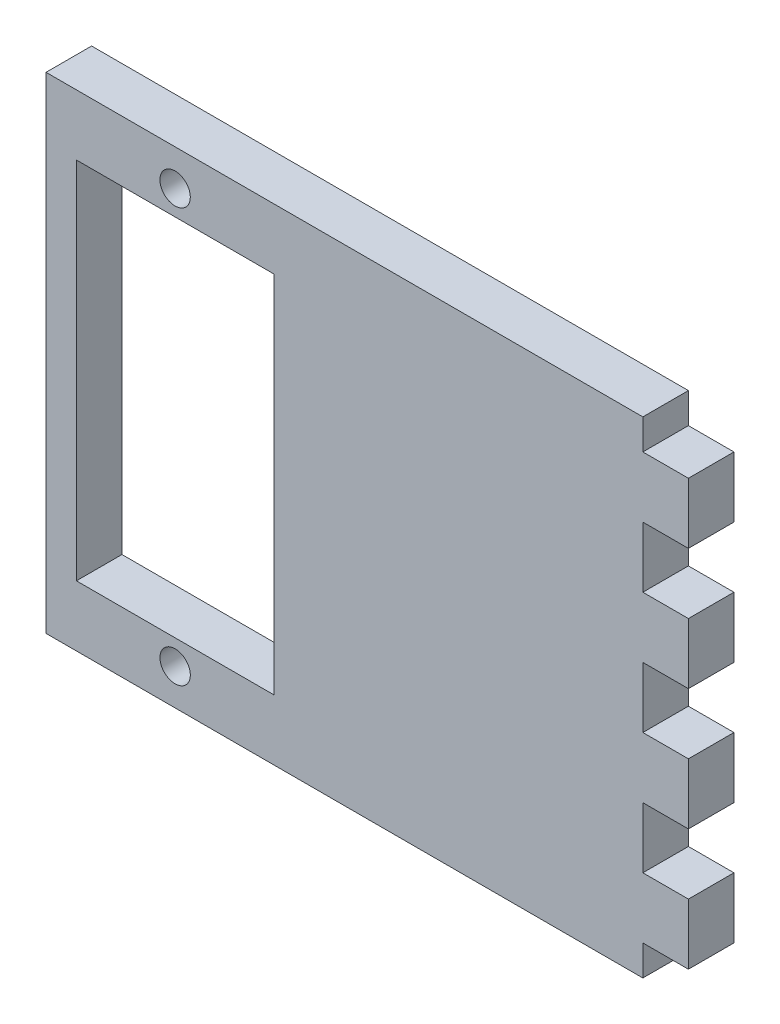
ISO-10303-21;
HEADER;
FILE_DESCRIPTION(('STEP AP214'),'2;1');
FILE_NAME('part.step','',(''),(''),'','','');
FILE_SCHEMA(('AUTOMOTIVE_DESIGN { 1 0 10303 214 1 1 1 1 }'));
ENDSEC;
DATA;
#1=APPLICATION_CONTEXT('core data for automotive mechanical design processes');
#2=APPLICATION_PROTOCOL_DEFINITION('international standard','automotive_design',2000,#1);
#3=PRODUCT_CONTEXT('',#1,'mechanical');
#4=PRODUCT('Part','Part','',(#3));
#5=PRODUCT_RELATED_PRODUCT_CATEGORY('part','',(#4));
#6=PRODUCT_DEFINITION_FORMATION('','',#4);
#7=PRODUCT_DEFINITION_CONTEXT('part definition',#1,'design');
#8=PRODUCT_DEFINITION('design','',#6,#7);
#9=PRODUCT_DEFINITION_SHAPE('','',#8);
#10=(LENGTH_UNIT() NAMED_UNIT(*) SI_UNIT(.MILLI.,.METRE.));
#11=(NAMED_UNIT(*) PLANE_ANGLE_UNIT() SI_UNIT($,.RADIAN.));
#12=(NAMED_UNIT(*) SI_UNIT($,.STERADIAN.) SOLID_ANGLE_UNIT());
#13=UNCERTAINTY_MEASURE_WITH_UNIT(LENGTH_MEASURE(1.E-05),#10,'distance_accuracy_value','');
#14=(GEOMETRIC_REPRESENTATION_CONTEXT(3) GLOBAL_UNCERTAINTY_ASSIGNED_CONTEXT((#13)) GLOBAL_UNIT_ASSIGNED_CONTEXT((#10,
#11,#12)) REPRESENTATION_CONTEXT('',''));
#15=CARTESIAN_POINT('',(0.,0.,0.));
#16=DIRECTION('',(0.,0.,1.));
#17=DIRECTION('',(1.,0.,0.));
#18=AXIS2_PLACEMENT_3D('',#15,#16,#17);
#19=CARTESIAN_POINT('',(0.,0.,3.));
#20=DIRECTION('',(0.,0.,-1.));
#21=DIRECTION('',(-1.,0.,0.));
#22=AXIS2_PLACEMENT_3D('',#19,#20,#21);
#23=PLANE('',#22);
#24=DIRECTION('',(0.,1.,0.));
#25=VECTOR('',#24,1.);
#26=CARTESIAN_POINT('',(30.8,14.,3.));
#27=LINE('',#26,#25);
#28=CARTESIAN_POINT('',(30.8,14.,3.));
#29=VERTEX_POINT('',#28);
#30=CARTESIAN_POINT('',(30.8,16.,3.));
#31=VERTEX_POINT('',#30);
#32=EDGE_CURVE('E252',#29,#31,#27,.T.);
#33=ORIENTED_EDGE('',*,*,#32,.T.);
#34=DIRECTION('',(-1.,0.,0.));
#35=VECTOR('',#34,1.);
#36=CARTESIAN_POINT('',(-8.5,16.,3.));
#37=LINE('',#36,#35);
#38=CARTESIAN_POINT('',(-8.5,16.,3.));
#39=VERTEX_POINT('',#38);
#40=EDGE_CURVE('E256',#31,#39,#37,.T.);
#41=ORIENTED_EDGE('',*,*,#40,.T.);
#42=DIRECTION('',(0.,-1.,0.));
#43=VECTOR('',#42,1.);
#44=CARTESIAN_POINT('',(-8.5,-16.,3.));
#45=LINE('',#44,#43);
#46=CARTESIAN_POINT('',(-8.5,-16.,3.));
#47=VERTEX_POINT('',#46);
#48=EDGE_CURVE('E260',#39,#47,#45,.T.);
#49=ORIENTED_EDGE('',*,*,#48,.T.);
#50=DIRECTION('',(1.,0.,0.));
#51=VECTOR('',#50,1.);
#52=CARTESIAN_POINT('',(-8.5,-16.,3.));
#53=LINE('',#52,#51);
#54=CARTESIAN_POINT('',(30.8,-16.,3.));
#55=VERTEX_POINT('',#54);
#56=EDGE_CURVE('E263',#47,#55,#53,.T.);
#57=ORIENTED_EDGE('',*,*,#56,.T.);
#58=DIRECTION('',(0.,1.,0.));
#59=VECTOR('',#58,1.);
#60=CARTESIAN_POINT('',(30.8,-16.,3.));
#61=LINE('',#60,#59);
#62=CARTESIAN_POINT('',(30.8,-14.,3.));
#63=VERTEX_POINT('',#62);
#64=EDGE_CURVE('E266',#55,#63,#61,.T.);
#65=ORIENTED_EDGE('',*,*,#64,.T.);
#66=DIRECTION('',(1.,0.,0.));
#67=VECTOR('',#66,1.);
#68=CARTESIAN_POINT('',(30.8,-14.,3.));
#69=LINE('',#68,#67);
#70=CARTESIAN_POINT('',(33.8,-14.,3.));
#71=VERTEX_POINT('',#70);
#72=EDGE_CURVE('E269',#63,#71,#69,.T.);
#73=ORIENTED_EDGE('',*,*,#72,.T.);
#74=DIRECTION('',(0.,1.,0.));
#75=VECTOR('',#74,1.);
#76=CARTESIAN_POINT('',(33.8,-14.,3.));
#77=LINE('',#76,#75);
#78=CARTESIAN_POINT('',(33.8,-10.,3.));
#79=VERTEX_POINT('',#78);
#80=EDGE_CURVE('E272',#71,#79,#77,.T.);
#81=ORIENTED_EDGE('',*,*,#80,.T.);
#82=DIRECTION('',(-1.,0.,0.));
#83=VECTOR('',#82,1.);
#84=CARTESIAN_POINT('',(33.8,-10.,3.));
#85=LINE('',#84,#83);
#86=CARTESIAN_POINT('',(30.8,-10.,3.));
#87=VERTEX_POINT('',#86);
#88=EDGE_CURVE('E275',#79,#87,#85,.T.);
#89=ORIENTED_EDGE('',*,*,#88,.T.);
#90=DIRECTION('',(0.,1.,0.));
#91=VECTOR('',#90,1.);
#92=CARTESIAN_POINT('',(30.8,-10.,3.));
#93=LINE('',#92,#91);
#94=CARTESIAN_POINT('',(30.8,-6.,3.));
#95=VERTEX_POINT('',#94);
#96=EDGE_CURVE('E278',#87,#95,#93,.T.);
#97=ORIENTED_EDGE('',*,*,#96,.T.);
#98=DIRECTION('',(1.,0.,0.));
#99=VECTOR('',#98,1.);
#100=CARTESIAN_POINT('',(30.8,-6.,3.));
#101=LINE('',#100,#99);
#102=CARTESIAN_POINT('',(33.8,-6.,3.));
#103=VERTEX_POINT('',#102);
#104=EDGE_CURVE('E281',#95,#103,#101,.T.);
#105=ORIENTED_EDGE('',*,*,#104,.T.);
#106=DIRECTION('',(0.,1.,0.));
#107=VECTOR('',#106,1.);
#108=CARTESIAN_POINT('',(33.8,-6.,3.));
#109=LINE('',#108,#107);
#110=CARTESIAN_POINT('',(33.8,-2.,3.));
#111=VERTEX_POINT('',#110);
#112=EDGE_CURVE('E284',#103,#111,#109,.T.);
#113=ORIENTED_EDGE('',*,*,#112,.T.);
#114=DIRECTION('',(-1.,0.,0.));
#115=VECTOR('',#114,1.);
#116=CARTESIAN_POINT('',(33.8,-2.,3.));
#117=LINE('',#116,#115);
#118=CARTESIAN_POINT('',(30.8,-2.,3.));
#119=VERTEX_POINT('',#118);
#120=EDGE_CURVE('E287',#111,#119,#117,.T.);
#121=ORIENTED_EDGE('',*,*,#120,.T.);
#122=DIRECTION('',(0.,1.,0.));
#123=VECTOR('',#122,1.);
#124=CARTESIAN_POINT('',(30.8,-2.,3.));
#125=LINE('',#124,#123);
#126=CARTESIAN_POINT('',(30.8,2.,3.));
#127=VERTEX_POINT('',#126);
#128=EDGE_CURVE('E290',#119,#127,#125,.T.);
#129=ORIENTED_EDGE('',*,*,#128,.T.);
#130=DIRECTION('',(1.,0.,0.));
#131=VECTOR('',#130,1.);
#132=CARTESIAN_POINT('',(33.8,2.,3.));
#133=LINE('',#132,#131);
#134=CARTESIAN_POINT('',(33.8,2.,3.));
#135=VERTEX_POINT('',#134);
#136=EDGE_CURVE('E293',#127,#135,#133,.T.);
#137=ORIENTED_EDGE('',*,*,#136,.T.);
#138=DIRECTION('',(0.,1.,0.));
#139=VECTOR('',#138,1.);
#140=CARTESIAN_POINT('',(33.8,6.,3.));
#141=LINE('',#140,#139);
#142=CARTESIAN_POINT('',(33.8,6.,3.));
#143=VERTEX_POINT('',#142);
#144=EDGE_CURVE('E296',#135,#143,#141,.T.);
#145=ORIENTED_EDGE('',*,*,#144,.T.);
#146=DIRECTION('',(-1.,0.,0.));
#147=VECTOR('',#146,1.);
#148=CARTESIAN_POINT('',(30.8,6.,3.));
#149=LINE('',#148,#147);
#150=CARTESIAN_POINT('',(30.8,6.,3.));
#151=VERTEX_POINT('',#150);
#152=EDGE_CURVE('E299',#143,#151,#149,.T.);
#153=ORIENTED_EDGE('',*,*,#152,.T.);
#154=DIRECTION('',(0.,1.,0.));
#155=VECTOR('',#154,1.);
#156=CARTESIAN_POINT('',(30.8,6.,3.));
#157=LINE('',#156,#155);
#158=CARTESIAN_POINT('',(30.8,10.,3.));
#159=VERTEX_POINT('',#158);
#160=EDGE_CURVE('E302',#151,#159,#157,.T.);
#161=ORIENTED_EDGE('',*,*,#160,.T.);
#162=DIRECTION('',(1.,0.,0.));
#163=VECTOR('',#162,1.);
#164=CARTESIAN_POINT('',(33.8,10.,3.));
#165=LINE('',#164,#163);
#166=CARTESIAN_POINT('',(33.8,10.,3.));
#167=VERTEX_POINT('',#166);
#168=EDGE_CURVE('E305',#159,#167,#165,.T.);
#169=ORIENTED_EDGE('',*,*,#168,.T.);
#170=DIRECTION('',(0.,1.,0.));
#171=VECTOR('',#170,1.);
#172=CARTESIAN_POINT('',(33.8,14.,3.));
#173=LINE('',#172,#171);
#174=CARTESIAN_POINT('',(33.8,14.,3.));
#175=VERTEX_POINT('',#174);
#176=EDGE_CURVE('E308',#167,#175,#173,.T.);
#177=ORIENTED_EDGE('',*,*,#176,.T.);
#178=DIRECTION('',(-1.,0.,0.));
#179=VECTOR('',#178,1.);
#180=CARTESIAN_POINT('',(30.8,14.,3.));
#181=LINE('',#180,#179);
#182=EDGE_CURVE('E311',#175,#29,#181,.T.);
#183=ORIENTED_EDGE('',*,*,#182,.T.);
#184=EDGE_LOOP('',(#33,#41,#49,#57,#65,#73,#81,#89,#97,#105,#113,#121,#129,#137,#145,#153,#161,
#169,#177,#183));
#185=FACE_BOUND('',#184,.T.);
#186=DIRECTION('',(0.,-1.,0.));
#187=VECTOR('',#186,1.);
#188=CARTESIAN_POINT('',(-6.5,-12.,3.));
#189=LINE('',#188,#187);
#190=CARTESIAN_POINT('',(-6.5,12.,3.));
#191=VERTEX_POINT('',#190);
#192=CARTESIAN_POINT('',(-6.5,-12.,3.));
#193=VERTEX_POINT('',#192);
#194=EDGE_CURVE('E201',#191,#193,#189,.T.);
#195=ORIENTED_EDGE('',*,*,#194,.F.);
#196=DIRECTION('',(-1.,0.,0.));
#197=VECTOR('',#196,1.);
#198=CARTESIAN_POINT('',(6.5,12.,3.));
#199=LINE('',#198,#197);
#200=CARTESIAN_POINT('',(6.5,12.,3.));
#201=VERTEX_POINT('',#200);
#202=EDGE_CURVE('E228',#201,#191,#199,.T.);
#203=ORIENTED_EDGE('',*,*,#202,.F.);
#204=DIRECTION('',(0.,1.,0.));
#205=VECTOR('',#204,1.);
#206=CARTESIAN_POINT('',(6.5,-12.,3.));
#207=LINE('',#206,#205);
#208=CARTESIAN_POINT('',(6.5,-12.,3.));
#209=VERTEX_POINT('',#208);
#210=EDGE_CURVE('E224',#209,#201,#207,.T.);
#211=ORIENTED_EDGE('',*,*,#210,.F.);
#212=DIRECTION('',(1.,0.,0.));
#213=VECTOR('',#212,1.);
#214=CARTESIAN_POINT('',(6.5,-12.,3.));
#215=LINE('',#214,#213);
#216=EDGE_CURVE('E210',#193,#209,#215,.T.);
#217=ORIENTED_EDGE('',*,*,#216,.F.);
#218=EDGE_LOOP('',(#195,#203,#211,#217));
#219=FACE_BOUND('',#218,.T.);
#220=CARTESIAN_POINT('',(0.,13.625,3.));
#221=DIRECTION('',(0.,0.,1.));
#222=DIRECTION('',(1.,0.,0.));
#223=AXIS2_PLACEMENT_3D('',#220,#221,#222);
#224=CIRCLE('',#223,1.);
#225=CARTESIAN_POINT('',(1.,13.625,3.));
#226=VERTEX_POINT('',#225);
#227=EDGE_CURVE('E236',#226,#226,#224,.T.);
#228=ORIENTED_EDGE('',*,*,#227,.F.);
#229=EDGE_LOOP('',(#228));
#230=FACE_BOUND('',#229,.T.);
#231=CARTESIAN_POINT('',(0.,-13.625,3.));
#232=DIRECTION('',(0.,0.,1.));
#233=DIRECTION('',(-1.,0.,0.));
#234=AXIS2_PLACEMENT_3D('',#231,#232,#233);
#235=CIRCLE('',#234,1.);
#236=CARTESIAN_POINT('',(-1.,-13.625,3.));
#237=VERTEX_POINT('',#236);
#238=EDGE_CURVE('E780',#237,#237,#235,.T.);
#239=ORIENTED_EDGE('',*,*,#238,.F.);
#240=EDGE_LOOP('',(#239));
#241=FACE_BOUND('',#240,.T.);
#242=ADVANCED_FACE('F39',(#185,#219,#230,#241),#23,.F.);
#243=CARTESIAN_POINT('',(0.,0.,0.));
#244=DIRECTION('',(0.,0.,-1.));
#245=DIRECTION('',(-1.,0.,0.));
#246=AXIS2_PLACEMENT_3D('',#243,#244,#245);
#247=PLANE('',#246);
#248=CARTESIAN_POINT('',(0.,13.625,0.));
#249=DIRECTION('',(0.,0.,1.));
#250=DIRECTION('',(1.,0.,0.));
#251=AXIS2_PLACEMENT_3D('',#248,#249,#250);
#252=CIRCLE('',#251,1.);
#253=CARTESIAN_POINT('',(1.,13.625,0.));
#254=VERTEX_POINT('',#253);
#255=EDGE_CURVE('E788',#254,#254,#252,.T.);
#256=ORIENTED_EDGE('',*,*,#255,.T.);
#257=EDGE_LOOP('',(#256));
#258=FACE_BOUND('',#257,.T.);
#259=DIRECTION('',(0.,1.,0.));
#260=VECTOR('',#259,1.);
#261=CARTESIAN_POINT('',(30.8,14.,0.));
#262=LINE('',#261,#260);
#263=CARTESIAN_POINT('',(30.8,14.,0.));
#264=VERTEX_POINT('',#263);
#265=CARTESIAN_POINT('',(30.8,16.,0.));
#266=VERTEX_POINT('',#265);
#267=EDGE_CURVE('E219',#264,#266,#262,.T.);
#268=ORIENTED_EDGE('',*,*,#267,.F.);
#269=DIRECTION('',(-1.,0.,0.));
#270=VECTOR('',#269,1.);
#271=CARTESIAN_POINT('',(30.8,14.,0.));
#272=LINE('',#271,#270);
#273=CARTESIAN_POINT('',(33.8,14.,0.));
#274=VERTEX_POINT('',#273);
#275=EDGE_CURVE('E257',#274,#264,#272,.T.);
#276=ORIENTED_EDGE('',*,*,#275,.F.);
#277=DIRECTION('',(0.,1.,0.));
#278=VECTOR('',#277,1.);
#279=CARTESIAN_POINT('',(33.8,14.,0.));
#280=LINE('',#279,#278);
#281=CARTESIAN_POINT('',(33.8,10.,0.));
#282=VERTEX_POINT('',#281);
#283=EDGE_CURVE('E369',#282,#274,#280,.T.);
#284=ORIENTED_EDGE('',*,*,#283,.F.);
#285=DIRECTION('',(1.,0.,0.));
#286=VECTOR('',#285,1.);
#287=CARTESIAN_POINT('',(33.8,10.,0.));
#288=LINE('',#287,#286);
#289=CARTESIAN_POINT('',(30.8,10.,0.));
#290=VERTEX_POINT('',#289);
#291=EDGE_CURVE('E366',#290,#282,#288,.T.);
#292=ORIENTED_EDGE('',*,*,#291,.F.);
#293=DIRECTION('',(0.,1.,0.));
#294=VECTOR('',#293,1.);
#295=CARTESIAN_POINT('',(30.8,6.,0.));
#296=LINE('',#295,#294);
#297=CARTESIAN_POINT('',(30.8,6.,0.));
#298=VERTEX_POINT('',#297);
#299=EDGE_CURVE('E363',#298,#290,#296,.T.);
#300=ORIENTED_EDGE('',*,*,#299,.F.);
#301=DIRECTION('',(-1.,0.,0.));
#302=VECTOR('',#301,1.);
#303=CARTESIAN_POINT('',(30.8,6.,0.));
#304=LINE('',#303,#302);
#305=CARTESIAN_POINT('',(33.8,6.,0.));
#306=VERTEX_POINT('',#305);
#307=EDGE_CURVE('E360',#306,#298,#304,.T.);
#308=ORIENTED_EDGE('',*,*,#307,.F.);
#309=DIRECTION('',(0.,1.,0.));
#310=VECTOR('',#309,1.);
#311=CARTESIAN_POINT('',(33.8,6.,0.));
#312=LINE('',#311,#310);
#313=CARTESIAN_POINT('',(33.8,2.,0.));
#314=VERTEX_POINT('',#313);
#315=EDGE_CURVE('E357',#314,#306,#312,.T.);
#316=ORIENTED_EDGE('',*,*,#315,.F.);
#317=DIRECTION('',(1.,0.,0.));
#318=VECTOR('',#317,1.);
#319=CARTESIAN_POINT('',(33.8,2.,0.));
#320=LINE('',#319,#318);
#321=CARTESIAN_POINT('',(30.8,2.,0.));
#322=VERTEX_POINT('',#321);
#323=EDGE_CURVE('E354',#322,#314,#320,.T.);
#324=ORIENTED_EDGE('',*,*,#323,.F.);
#325=DIRECTION('',(0.,1.,0.));
#326=VECTOR('',#325,1.);
#327=CARTESIAN_POINT('',(30.8,-2.,0.));
#328=LINE('',#327,#326);
#329=CARTESIAN_POINT('',(30.8,-2.,0.));
#330=VERTEX_POINT('',#329);
#331=EDGE_CURVE('E351',#330,#322,#328,.T.);
#332=ORIENTED_EDGE('',*,*,#331,.F.);
#333=DIRECTION('',(-1.,0.,0.));
#334=VECTOR('',#333,1.);
#335=CARTESIAN_POINT('',(33.8,-2.,0.));
#336=LINE('',#335,#334);
#337=CARTESIAN_POINT('',(33.8,-2.,0.));
#338=VERTEX_POINT('',#337);
#339=EDGE_CURVE('E348',#338,#330,#336,.T.);
#340=ORIENTED_EDGE('',*,*,#339,.F.);
#341=DIRECTION('',(0.,1.,0.));
#342=VECTOR('',#341,1.);
#343=CARTESIAN_POINT('',(33.8,-6.,0.));
#344=LINE('',#343,#342);
#345=CARTESIAN_POINT('',(33.8,-6.,0.));
#346=VERTEX_POINT('',#345);
#347=EDGE_CURVE('E345',#346,#338,#344,.T.);
#348=ORIENTED_EDGE('',*,*,#347,.F.);
#349=DIRECTION('',(1.,0.,0.));
#350=VECTOR('',#349,1.);
#351=CARTESIAN_POINT('',(30.8,-6.,0.));
#352=LINE('',#351,#350);
#353=CARTESIAN_POINT('',(30.8,-6.,0.));
#354=VERTEX_POINT('',#353);
#355=EDGE_CURVE('E342',#354,#346,#352,.T.);
#356=ORIENTED_EDGE('',*,*,#355,.F.);
#357=DIRECTION('',(0.,1.,0.));
#358=VECTOR('',#357,1.);
#359=CARTESIAN_POINT('',(30.8,-10.,0.));
#360=LINE('',#359,#358);
#361=CARTESIAN_POINT('',(30.8,-10.,0.));
#362=VERTEX_POINT('',#361);
#363=EDGE_CURVE('E339',#362,#354,#360,.T.);
#364=ORIENTED_EDGE('',*,*,#363,.F.);
#365=DIRECTION('',(-1.,0.,0.));
#366=VECTOR('',#365,1.);
#367=CARTESIAN_POINT('',(33.8,-10.,0.));
#368=LINE('',#367,#366);
#369=CARTESIAN_POINT('',(33.8,-10.,0.));
#370=VERTEX_POINT('',#369);
#371=EDGE_CURVE('E336',#370,#362,#368,.T.);
#372=ORIENTED_EDGE('',*,*,#371,.F.);
#373=DIRECTION('',(0.,1.,0.));
#374=VECTOR('',#373,1.);
#375=CARTESIAN_POINT('',(33.8,-14.,0.));
#376=LINE('',#375,#374);
#377=CARTESIAN_POINT('',(33.8,-14.,0.));
#378=VERTEX_POINT('',#377);
#379=EDGE_CURVE('E333',#378,#370,#376,.T.);
#380=ORIENTED_EDGE('',*,*,#379,.F.);
#381=DIRECTION('',(1.,0.,0.));
#382=VECTOR('',#381,1.);
#383=CARTESIAN_POINT('',(30.8,-14.,0.));
#384=LINE('',#383,#382);
#385=CARTESIAN_POINT('',(30.8,-14.,0.));
#386=VERTEX_POINT('',#385);
#387=EDGE_CURVE('E330',#386,#378,#384,.T.);
#388=ORIENTED_EDGE('',*,*,#387,.F.);
#389=DIRECTION('',(0.,1.,0.));
#390=VECTOR('',#389,1.);
#391=CARTESIAN_POINT('',(30.8,-16.,0.));
#392=LINE('',#391,#390);
#393=CARTESIAN_POINT('',(30.8,-16.,0.));
#394=VERTEX_POINT('',#393);
#395=EDGE_CURVE('E327',#394,#386,#392,.T.);
#396=ORIENTED_EDGE('',*,*,#395,.F.);
#397=DIRECTION('',(1.,0.,0.));
#398=VECTOR('',#397,1.);
#399=CARTESIAN_POINT('',(-8.5,-16.,0.));
#400=LINE('',#399,#398);
#401=CARTESIAN_POINT('',(-8.5,-16.,0.));
#402=VERTEX_POINT('',#401);
#403=EDGE_CURVE('E324',#402,#394,#400,.T.);
#404=ORIENTED_EDGE('',*,*,#403,.F.);
#405=DIRECTION('',(0.,-1.,0.));
#406=VECTOR('',#405,1.);
#407=CARTESIAN_POINT('',(-8.5,-16.,0.));
#408=LINE('',#407,#406);
#409=CARTESIAN_POINT('',(-8.5,16.,0.));
#410=VERTEX_POINT('',#409);
#411=EDGE_CURVE('E321',#410,#402,#408,.T.);
#412=ORIENTED_EDGE('',*,*,#411,.F.);
#413=DIRECTION('',(-1.,0.,0.));
#414=VECTOR('',#413,1.);
#415=CARTESIAN_POINT('',(-8.5,16.,0.));
#416=LINE('',#415,#414);
#417=EDGE_CURVE('E318',#266,#410,#416,.T.);
#418=ORIENTED_EDGE('',*,*,#417,.F.);
#419=EDGE_LOOP('',(#268,#276,#284,#292,#300,#308,#316,#324,#332,#340,#348,#356,#364,#372,#380,
#388,#396,#404,#412,#418));
#420=FACE_BOUND('',#419,.T.);
#421=DIRECTION('',(-1.,0.,0.));
#422=VECTOR('',#421,1.);
#423=CARTESIAN_POINT('',(6.5,12.,0.));
#424=LINE('',#423,#422);
#425=CARTESIAN_POINT('',(6.5,12.,0.));
#426=VERTEX_POINT('',#425);
#427=CARTESIAN_POINT('',(-6.5,12.,0.));
#428=VERTEX_POINT('',#427);
#429=EDGE_CURVE('E211',#426,#428,#424,.T.);
#430=ORIENTED_EDGE('',*,*,#429,.T.);
#431=DIRECTION('',(0.,-1.,0.));
#432=VECTOR('',#431,1.);
#433=CARTESIAN_POINT('',(-6.5,-12.,0.));
#434=LINE('',#433,#432);
#435=CARTESIAN_POINT('',(-6.5,-12.,0.));
#436=VERTEX_POINT('',#435);
#437=EDGE_CURVE('E63',#428,#436,#434,.T.);
#438=ORIENTED_EDGE('',*,*,#437,.T.);
#439=DIRECTION('',(1.,0.,0.));
#440=VECTOR('',#439,1.);
#441=CARTESIAN_POINT('',(6.5,-12.,0.));
#442=LINE('',#441,#440);
#443=CARTESIAN_POINT('',(6.5,-12.,0.));
#444=VERTEX_POINT('',#443);
#445=EDGE_CURVE('E217',#436,#444,#442,.T.);
#446=ORIENTED_EDGE('',*,*,#445,.T.);
#447=DIRECTION('',(0.,1.,0.));
#448=VECTOR('',#447,1.);
#449=CARTESIAN_POINT('',(6.5,-12.,0.));
#450=LINE('',#449,#448);
#451=EDGE_CURVE('E239',#444,#426,#450,.T.);
#452=ORIENTED_EDGE('',*,*,#451,.T.);
#453=EDGE_LOOP('',(#430,#438,#446,#452));
#454=FACE_BOUND('',#453,.T.);
#455=CARTESIAN_POINT('',(0.,-13.625,0.));
#456=DIRECTION('',(0.,0.,1.));
#457=DIRECTION('',(-1.,0.,0.));
#458=AXIS2_PLACEMENT_3D('',#455,#456,#457);
#459=CIRCLE('',#458,1.);
#460=CARTESIAN_POINT('',(-1.,-13.625,0.));
#461=VERTEX_POINT('',#460);
#462=EDGE_CURVE('E783',#461,#461,#459,.T.);
#463=ORIENTED_EDGE('',*,*,#462,.T.);
#464=EDGE_LOOP('',(#463));
#465=FACE_BOUND('',#464,.T.);
#466=ADVANCED_FACE('F456',(#258,#420,#454,#465),#247,.T.);
#467=CARTESIAN_POINT('',(30.8,14.,3.));
#468=DIRECTION('',(-1.,0.,0.));
#469=DIRECTION('',(0.,0.,1.));
#470=AXIS2_PLACEMENT_3D('',#467,#468,#469);
#471=PLANE('',#470);
#472=ORIENTED_EDGE('',*,*,#267,.T.);
#473=DIRECTION('',(0.,0.,-1.));
#474=VECTOR('',#473,1.);
#475=CARTESIAN_POINT('',(30.8,16.,3.));
#476=LINE('',#475,#474);
#477=EDGE_CURVE('E11',#31,#266,#476,.T.);
#478=ORIENTED_EDGE('',*,*,#477,.F.);
#479=ORIENTED_EDGE('',*,*,#32,.F.);
#480=DIRECTION('',(0.,0.,-1.));
#481=VECTOR('',#480,1.);
#482=CARTESIAN_POINT('',(30.8,14.,3.));
#483=LINE('',#482,#481);
#484=EDGE_CURVE('E314',#29,#264,#483,.T.);
#485=ORIENTED_EDGE('',*,*,#484,.T.);
#486=EDGE_LOOP('',(#472,#478,#479,#485));
#487=FACE_BOUND('',#486,.T.);
#488=ADVANCED_FACE('F41',(#487),#471,.F.);
#489=CARTESIAN_POINT('',(-8.5,16.,3.));
#490=DIRECTION('',(0.,-1.,0.));
#491=DIRECTION('',(0.,0.,-1.));
#492=AXIS2_PLACEMENT_3D('',#489,#490,#491);
#493=PLANE('',#492);
#494=ORIENTED_EDGE('',*,*,#417,.T.);
#495=DIRECTION('',(0.,0.,-1.));
#496=VECTOR('',#495,1.);
#497=CARTESIAN_POINT('',(-8.5,16.,3.));
#498=LINE('',#497,#496);
#499=EDGE_CURVE('E48',#39,#410,#498,.T.);
#500=ORIENTED_EDGE('',*,*,#499,.F.);
#501=ORIENTED_EDGE('',*,*,#40,.F.);
#502=ORIENTED_EDGE('',*,*,#477,.T.);
#503=EDGE_LOOP('',(#494,#500,#501,#502));
#504=FACE_BOUND('',#503,.T.);
#505=ADVANCED_FACE('F473',(#504),#493,.F.);
#506=CARTESIAN_POINT('',(-8.5,-16.,3.));
#507=DIRECTION('',(1.,0.,0.));
#508=DIRECTION('',(0.,0.,-1.));
#509=AXIS2_PLACEMENT_3D('',#506,#507,#508);
#510=PLANE('',#509);
#511=ORIENTED_EDGE('',*,*,#411,.T.);
#512=DIRECTION('',(0.,0.,-1.));
#513=VECTOR('',#512,1.);
#514=CARTESIAN_POINT('',(-8.5,-16.,3.));
#515=LINE('',#514,#513);
#516=EDGE_CURVE('E441',#47,#402,#515,.T.);
#517=ORIENTED_EDGE('',*,*,#516,.F.);
#518=ORIENTED_EDGE('',*,*,#48,.F.);
#519=ORIENTED_EDGE('',*,*,#499,.T.);
#520=EDGE_LOOP('',(#511,#517,#518,#519));
#521=FACE_BOUND('',#520,.T.);
#522=ADVANCED_FACE('F450',(#521),#510,.F.);
#523=CARTESIAN_POINT('',(-8.5,-16.,3.));
#524=DIRECTION('',(0.,1.,0.));
#525=DIRECTION('',(0.,0.,1.));
#526=AXIS2_PLACEMENT_3D('',#523,#524,#525);
#527=PLANE('',#526);
#528=ORIENTED_EDGE('',*,*,#403,.T.);
#529=DIRECTION('',(0.,0.,-1.));
#530=VECTOR('',#529,1.);
#531=CARTESIAN_POINT('',(30.8,-16.,3.));
#532=LINE('',#531,#530);
#533=EDGE_CURVE('E437',#55,#394,#532,.T.);
#534=ORIENTED_EDGE('',*,*,#533,.F.);
#535=ORIENTED_EDGE('',*,*,#56,.F.);
#536=ORIENTED_EDGE('',*,*,#516,.T.);
#537=EDGE_LOOP('',(#528,#534,#535,#536));
#538=FACE_BOUND('',#537,.T.);
#539=ADVANCED_FACE('F462',(#538),#527,.F.);
#540=CARTESIAN_POINT('',(30.8,-16.,3.));
#541=DIRECTION('',(-1.,0.,0.));
#542=DIRECTION('',(0.,0.,1.));
#543=AXIS2_PLACEMENT_3D('',#540,#541,#542);
#544=PLANE('',#543);
#545=ORIENTED_EDGE('',*,*,#395,.T.);
#546=DIRECTION('',(0.,0.,-1.));
#547=VECTOR('',#546,1.);
#548=CARTESIAN_POINT('',(30.8,-14.,3.));
#549=LINE('',#548,#547);
#550=EDGE_CURVE('E433',#63,#386,#549,.T.);
#551=ORIENTED_EDGE('',*,*,#550,.F.);
#552=ORIENTED_EDGE('',*,*,#64,.F.);
#553=ORIENTED_EDGE('',*,*,#533,.T.);
#554=EDGE_LOOP('',(#545,#551,#552,#553));
#555=FACE_BOUND('',#554,.T.);
#556=ADVANCED_FACE('F466',(#555),#544,.F.);
#557=CARTESIAN_POINT('',(30.8,-14.,3.));
#558=DIRECTION('',(0.,1.,0.));
#559=DIRECTION('',(0.,0.,1.));
#560=AXIS2_PLACEMENT_3D('',#557,#558,#559);
#561=PLANE('',#560);
#562=ORIENTED_EDGE('',*,*,#387,.T.);
#563=DIRECTION('',(0.,0.,-1.));
#564=VECTOR('',#563,1.);
#565=CARTESIAN_POINT('',(33.8,-14.,3.));
#566=LINE('',#565,#564);
#567=EDGE_CURVE('E429',#71,#378,#566,.T.);
#568=ORIENTED_EDGE('',*,*,#567,.F.);
#569=ORIENTED_EDGE('',*,*,#72,.F.);
#570=ORIENTED_EDGE('',*,*,#550,.T.);
#571=EDGE_LOOP('',(#562,#568,#569,#570));
#572=FACE_BOUND('',#571,.T.);
#573=ADVANCED_FACE('F546',(#572),#561,.F.);
#574=CARTESIAN_POINT('',(33.8,-14.,3.));
#575=DIRECTION('',(-1.,0.,0.));
#576=DIRECTION('',(0.,0.,1.));
#577=AXIS2_PLACEMENT_3D('',#574,#575,#576);
#578=PLANE('',#577);
#579=ORIENTED_EDGE('',*,*,#379,.T.);
#580=DIRECTION('',(0.,0.,-1.));
#581=VECTOR('',#580,1.);
#582=CARTESIAN_POINT('',(33.8,-10.,3.));
#583=LINE('',#582,#581);
#584=EDGE_CURVE('E425',#79,#370,#583,.T.);
#585=ORIENTED_EDGE('',*,*,#584,.F.);
#586=ORIENTED_EDGE('',*,*,#80,.F.);
#587=ORIENTED_EDGE('',*,*,#567,.T.);
#588=EDGE_LOOP('',(#579,#585,#586,#587));
#589=FACE_BOUND('',#588,.T.);
#590=ADVANCED_FACE('F544',(#589),#578,.F.);
#591=CARTESIAN_POINT('',(33.8,-10.,3.));
#592=DIRECTION('',(0.,-1.,0.));
#593=DIRECTION('',(0.,0.,-1.));
#594=AXIS2_PLACEMENT_3D('',#591,#592,#593);
#595=PLANE('',#594);
#596=ORIENTED_EDGE('',*,*,#371,.T.);
#597=DIRECTION('',(0.,0.,-1.));
#598=VECTOR('',#597,1.);
#599=CARTESIAN_POINT('',(30.8,-10.,3.));
#600=LINE('',#599,#598);
#601=EDGE_CURVE('E421',#87,#362,#600,.T.);
#602=ORIENTED_EDGE('',*,*,#601,.F.);
#603=ORIENTED_EDGE('',*,*,#88,.F.);
#604=ORIENTED_EDGE('',*,*,#584,.T.);
#605=EDGE_LOOP('',(#596,#602,#603,#604));
#606=FACE_BOUND('',#605,.T.);
#607=ADVANCED_FACE('F539',(#606),#595,.F.);
#608=CARTESIAN_POINT('',(30.8,-10.,3.));
#609=DIRECTION('',(-1.,0.,0.));
#610=DIRECTION('',(0.,0.,1.));
#611=AXIS2_PLACEMENT_3D('',#608,#609,#610);
#612=PLANE('',#611);
#613=ORIENTED_EDGE('',*,*,#363,.T.);
#614=DIRECTION('',(0.,0.,-1.));
#615=VECTOR('',#614,1.);
#616=CARTESIAN_POINT('',(30.8,-6.,3.));
#617=LINE('',#616,#615);
#618=EDGE_CURVE('E417',#95,#354,#617,.T.);
#619=ORIENTED_EDGE('',*,*,#618,.F.);
#620=ORIENTED_EDGE('',*,*,#96,.F.);
#621=ORIENTED_EDGE('',*,*,#601,.T.);
#622=EDGE_LOOP('',(#613,#619,#620,#621));
#623=FACE_BOUND('',#622,.T.);
#624=ADVANCED_FACE('F534',(#623),#612,.F.);
#625=CARTESIAN_POINT('',(30.8,-6.,3.));
#626=DIRECTION('',(0.,1.,0.));
#627=DIRECTION('',(0.,0.,1.));
#628=AXIS2_PLACEMENT_3D('',#625,#626,#627);
#629=PLANE('',#628);
#630=ORIENTED_EDGE('',*,*,#355,.T.);
#631=DIRECTION('',(0.,0.,-1.));
#632=VECTOR('',#631,1.);
#633=CARTESIAN_POINT('',(33.8,-6.,3.));
#634=LINE('',#633,#632);
#635=EDGE_CURVE('E413',#103,#346,#634,.T.);
#636=ORIENTED_EDGE('',*,*,#635,.F.);
#637=ORIENTED_EDGE('',*,*,#104,.F.);
#638=ORIENTED_EDGE('',*,*,#618,.T.);
#639=EDGE_LOOP('',(#630,#636,#637,#638));
#640=FACE_BOUND('',#639,.T.);
#641=ADVANCED_FACE('F530',(#640),#629,.F.);
#642=CARTESIAN_POINT('',(33.8,-6.,3.));
#643=DIRECTION('',(-1.,0.,0.));
#644=DIRECTION('',(0.,0.,1.));
#645=AXIS2_PLACEMENT_3D('',#642,#643,#644);
#646=PLANE('',#645);
#647=ORIENTED_EDGE('',*,*,#347,.T.);
#648=DIRECTION('',(0.,0.,-1.));
#649=VECTOR('',#648,1.);
#650=CARTESIAN_POINT('',(33.8,-2.,3.));
#651=LINE('',#650,#649);
#652=EDGE_CURVE('E409',#111,#338,#651,.T.);
#653=ORIENTED_EDGE('',*,*,#652,.F.);
#654=ORIENTED_EDGE('',*,*,#112,.F.);
#655=ORIENTED_EDGE('',*,*,#635,.T.);
#656=EDGE_LOOP('',(#647,#653,#654,#655));
#657=FACE_BOUND('',#656,.T.);
#658=ADVANCED_FACE('F525',(#657),#646,.F.);
#659=CARTESIAN_POINT('',(33.8,-2.,3.));
#660=DIRECTION('',(0.,-1.,0.));
#661=DIRECTION('',(1.,0.,0.));
#662=AXIS2_PLACEMENT_3D('',#659,#660,#661);
#663=PLANE('',#662);
#664=ORIENTED_EDGE('',*,*,#339,.T.);
#665=DIRECTION('',(0.,0.,-1.));
#666=VECTOR('',#665,1.);
#667=CARTESIAN_POINT('',(30.8,-2.,3.));
#668=LINE('',#667,#666);
#669=EDGE_CURVE('E405',#119,#330,#668,.T.);
#670=ORIENTED_EDGE('',*,*,#669,.F.);
#671=ORIENTED_EDGE('',*,*,#120,.F.);
#672=ORIENTED_EDGE('',*,*,#652,.T.);
#673=EDGE_LOOP('',(#664,#670,#671,#672));
#674=FACE_BOUND('',#673,.T.);
#675=ADVANCED_FACE('F519',(#674),#663,.F.);
#676=CARTESIAN_POINT('',(30.8,-2.,3.));
#677=DIRECTION('',(-1.,0.,0.));
#678=DIRECTION('',(0.,0.,1.));
#679=AXIS2_PLACEMENT_3D('',#676,#677,#678);
#680=PLANE('',#679);
#681=ORIENTED_EDGE('',*,*,#331,.T.);
#682=DIRECTION('',(0.,0.,-1.));
#683=VECTOR('',#682,1.);
#684=CARTESIAN_POINT('',(30.8,2.,3.));
#685=LINE('',#684,#683);
#686=EDGE_CURVE('E401',#127,#322,#685,.T.);
#687=ORIENTED_EDGE('',*,*,#686,.F.);
#688=ORIENTED_EDGE('',*,*,#128,.F.);
#689=ORIENTED_EDGE('',*,*,#669,.T.);
#690=EDGE_LOOP('',(#681,#687,#688,#689));
#691=FACE_BOUND('',#690,.T.);
#692=ADVANCED_FACE('F515',(#691),#680,.F.);
#693=CARTESIAN_POINT('',(33.8,2.,3.));
#694=DIRECTION('',(0.,1.,0.));
#695=DIRECTION('',(-1.,0.,0.));
#696=AXIS2_PLACEMENT_3D('',#693,#694,#695);
#697=PLANE('',#696);
#698=ORIENTED_EDGE('',*,*,#323,.T.);
#699=DIRECTION('',(0.,0.,-1.));
#700=VECTOR('',#699,1.);
#701=CARTESIAN_POINT('',(33.8,2.,3.));
#702=LINE('',#701,#700);
#703=EDGE_CURVE('E397',#135,#314,#702,.T.);
#704=ORIENTED_EDGE('',*,*,#703,.F.);
#705=ORIENTED_EDGE('',*,*,#136,.F.);
#706=ORIENTED_EDGE('',*,*,#686,.T.);
#707=EDGE_LOOP('',(#698,#704,#705,#706));
#708=FACE_BOUND('',#707,.T.);
#709=ADVANCED_FACE('F510',(#708),#697,.F.);
#710=CARTESIAN_POINT('',(33.8,6.,3.));
#711=DIRECTION('',(-1.,0.,0.));
#712=DIRECTION('',(0.,0.,1.));
#713=AXIS2_PLACEMENT_3D('',#710,#711,#712);
#714=PLANE('',#713);
#715=ORIENTED_EDGE('',*,*,#315,.T.);
#716=DIRECTION('',(0.,0.,-1.));
#717=VECTOR('',#716,1.);
#718=CARTESIAN_POINT('',(33.8,6.,3.));
#719=LINE('',#718,#717);
#720=EDGE_CURVE('E393',#143,#306,#719,.T.);
#721=ORIENTED_EDGE('',*,*,#720,.F.);
#722=ORIENTED_EDGE('',*,*,#144,.F.);
#723=ORIENTED_EDGE('',*,*,#703,.T.);
#724=EDGE_LOOP('',(#715,#721,#722,#723));
#725=FACE_BOUND('',#724,.T.);
#726=ADVANCED_FACE('F504',(#725),#714,.F.);
#727=CARTESIAN_POINT('',(30.8,6.,3.));
#728=DIRECTION('',(0.,-1.,0.));
#729=DIRECTION('',(0.,0.,-1.));
#730=AXIS2_PLACEMENT_3D('',#727,#728,#729);
#731=PLANE('',#730);
#732=ORIENTED_EDGE('',*,*,#307,.T.);
#733=DIRECTION('',(0.,0.,-1.));
#734=VECTOR('',#733,1.);
#735=CARTESIAN_POINT('',(30.8,6.,3.));
#736=LINE('',#735,#734);
#737=EDGE_CURVE('E389',#151,#298,#736,.T.);
#738=ORIENTED_EDGE('',*,*,#737,.F.);
#739=ORIENTED_EDGE('',*,*,#152,.F.);
#740=ORIENTED_EDGE('',*,*,#720,.T.);
#741=EDGE_LOOP('',(#732,#738,#739,#740));
#742=FACE_BOUND('',#741,.T.);
#743=ADVANCED_FACE('F500',(#742),#731,.F.);
#744=CARTESIAN_POINT('',(30.8,6.,3.));
#745=DIRECTION('',(-1.,0.,0.));
#746=DIRECTION('',(0.,0.,1.));
#747=AXIS2_PLACEMENT_3D('',#744,#745,#746);
#748=PLANE('',#747);
#749=ORIENTED_EDGE('',*,*,#299,.T.);
#750=DIRECTION('',(0.,0.,-1.));
#751=VECTOR('',#750,1.);
#752=CARTESIAN_POINT('',(30.8,10.,3.));
#753=LINE('',#752,#751);
#754=EDGE_CURVE('E385',#159,#290,#753,.T.);
#755=ORIENTED_EDGE('',*,*,#754,.F.);
#756=ORIENTED_EDGE('',*,*,#160,.F.);
#757=ORIENTED_EDGE('',*,*,#737,.T.);
#758=EDGE_LOOP('',(#749,#755,#756,#757));
#759=FACE_BOUND('',#758,.T.);
#760=ADVANCED_FACE('F495',(#759),#748,.F.);
#761=CARTESIAN_POINT('',(33.8,10.,3.));
#762=DIRECTION('',(0.,1.,0.));
#763=DIRECTION('',(0.,0.,1.));
#764=AXIS2_PLACEMENT_3D('',#761,#762,#763);
#765=PLANE('',#764);
#766=ORIENTED_EDGE('',*,*,#291,.T.);
#767=DIRECTION('',(0.,0.,-1.));
#768=VECTOR('',#767,1.);
#769=CARTESIAN_POINT('',(33.8,10.,3.));
#770=LINE('',#769,#768);
#771=EDGE_CURVE('E381',#167,#282,#770,.T.);
#772=ORIENTED_EDGE('',*,*,#771,.F.);
#773=ORIENTED_EDGE('',*,*,#168,.F.);
#774=ORIENTED_EDGE('',*,*,#754,.T.);
#775=EDGE_LOOP('',(#766,#772,#773,#774));
#776=FACE_BOUND('',#775,.T.);
#777=ADVANCED_FACE('F489',(#776),#765,.F.);
#778=CARTESIAN_POINT('',(33.8,14.,3.));
#779=DIRECTION('',(-1.,0.,0.));
#780=DIRECTION('',(0.,0.,1.));
#781=AXIS2_PLACEMENT_3D('',#778,#779,#780);
#782=PLANE('',#781);
#783=ORIENTED_EDGE('',*,*,#283,.T.);
#784=DIRECTION('',(0.,0.,-1.));
#785=VECTOR('',#784,1.);
#786=CARTESIAN_POINT('',(33.8,14.,3.));
#787=LINE('',#786,#785);
#788=EDGE_CURVE('E377',#175,#274,#787,.T.);
#789=ORIENTED_EDGE('',*,*,#788,.F.);
#790=ORIENTED_EDGE('',*,*,#176,.F.);
#791=ORIENTED_EDGE('',*,*,#771,.T.);
#792=EDGE_LOOP('',(#783,#789,#790,#791));
#793=FACE_BOUND('',#792,.T.);
#794=ADVANCED_FACE('F485',(#793),#782,.F.);
#795=CARTESIAN_POINT('',(30.8,14.,3.));
#796=DIRECTION('',(0.,-1.,0.));
#797=DIRECTION('',(0.,0.,-1.));
#798=AXIS2_PLACEMENT_3D('',#795,#796,#797);
#799=PLANE('',#798);
#800=ORIENTED_EDGE('',*,*,#275,.T.);
#801=ORIENTED_EDGE('',*,*,#484,.F.);
#802=ORIENTED_EDGE('',*,*,#182,.F.);
#803=ORIENTED_EDGE('',*,*,#788,.T.);
#804=EDGE_LOOP('',(#800,#801,#802,#803));
#805=FACE_BOUND('',#804,.T.);
#806=ADVANCED_FACE('F480',(#805),#799,.F.);
#807=CARTESIAN_POINT('',(-6.5,-12.,3.));
#808=DIRECTION('',(1.,0.,0.));
#809=DIRECTION('',(0.,0.,-1.));
#810=AXIS2_PLACEMENT_3D('',#807,#808,#809);
#811=PLANE('',#810);
#812=ORIENTED_EDGE('',*,*,#437,.F.);
#813=DIRECTION('',(0.,0.,-1.));
#814=VECTOR('',#813,1.);
#815=CARTESIAN_POINT('',(-6.5,12.,3.));
#816=LINE('',#815,#814);
#817=EDGE_CURVE('E205',#191,#428,#816,.T.);
#818=ORIENTED_EDGE('',*,*,#817,.F.);
#819=ORIENTED_EDGE('',*,*,#194,.T.);
#820=DIRECTION('',(0.,0.,-1.));
#821=VECTOR('',#820,1.);
#822=CARTESIAN_POINT('',(-6.5,-12.,3.));
#823=LINE('',#822,#821);
#824=EDGE_CURVE('E204',#193,#436,#823,.T.);
#825=ORIENTED_EDGE('',*,*,#824,.T.);
#826=EDGE_LOOP('',(#812,#818,#819,#825));
#827=FACE_BOUND('',#826,.T.);
#828=ADVANCED_FACE('F203',(#827),#811,.T.);
#829=CARTESIAN_POINT('',(6.5,-12.,3.));
#830=DIRECTION('',(0.,1.,0.));
#831=DIRECTION('',(0.,0.,1.));
#832=AXIS2_PLACEMENT_3D('',#829,#830,#831);
#833=PLANE('',#832);
#834=ORIENTED_EDGE('',*,*,#445,.F.);
#835=ORIENTED_EDGE('',*,*,#824,.F.);
#836=ORIENTED_EDGE('',*,*,#216,.T.);
#837=DIRECTION('',(0.,0.,-1.));
#838=VECTOR('',#837,1.);
#839=CARTESIAN_POINT('',(6.5,-12.,3.));
#840=LINE('',#839,#838);
#841=EDGE_CURVE('E220',#209,#444,#840,.T.);
#842=ORIENTED_EDGE('',*,*,#841,.T.);
#843=EDGE_LOOP('',(#834,#835,#836,#842));
#844=FACE_BOUND('',#843,.T.);
#845=ADVANCED_FACE('F214',(#844),#833,.T.);
#846=CARTESIAN_POINT('',(6.5,-12.,3.));
#847=DIRECTION('',(-1.,0.,0.));
#848=DIRECTION('',(0.,0.,1.));
#849=AXIS2_PLACEMENT_3D('',#846,#847,#848);
#850=PLANE('',#849);
#851=ORIENTED_EDGE('',*,*,#451,.F.);
#852=ORIENTED_EDGE('',*,*,#841,.F.);
#853=ORIENTED_EDGE('',*,*,#210,.T.);
#854=DIRECTION('',(0.,0.,-1.));
#855=VECTOR('',#854,1.);
#856=CARTESIAN_POINT('',(6.5,12.,3.));
#857=LINE('',#856,#855);
#858=EDGE_CURVE('E55',#201,#426,#857,.T.);
#859=ORIENTED_EDGE('',*,*,#858,.T.);
#860=EDGE_LOOP('',(#851,#852,#853,#859));
#861=FACE_BOUND('',#860,.T.);
#862=ADVANCED_FACE('F653',(#861),#850,.T.);
#863=CARTESIAN_POINT('',(6.5,12.,3.));
#864=DIRECTION('',(0.,-1.,0.));
#865=DIRECTION('',(1.,0.,0.));
#866=AXIS2_PLACEMENT_3D('',#863,#864,#865);
#867=PLANE('',#866);
#868=ORIENTED_EDGE('',*,*,#429,.F.);
#869=ORIENTED_EDGE('',*,*,#858,.F.);
#870=ORIENTED_EDGE('',*,*,#202,.T.);
#871=ORIENTED_EDGE('',*,*,#817,.T.);
#872=EDGE_LOOP('',(#868,#869,#870,#871));
#873=FACE_BOUND('',#872,.T.);
#874=ADVANCED_FACE('F659',(#873),#867,.T.);
#875=CARTESIAN_POINT('',(0.,13.625,3.));
#876=DIRECTION('',(0.,0.,-1.));
#877=DIRECTION('',(-1.,0.,0.));
#878=AXIS2_PLACEMENT_3D('',#875,#876,#877);
#879=CYLINDRICAL_SURFACE('',#878,1.);
#880=ORIENTED_EDGE('',*,*,#227,.T.);
#881=EDGE_LOOP('',(#880));
#882=FACE_BOUND('',#881,.T.);
#883=ORIENTED_EDGE('',*,*,#255,.F.);
#884=EDGE_LOOP('',(#883));
#885=FACE_BOUND('',#884,.T.);
#886=ADVANCED_FACE('F667',(#882,#885),#879,.F.);
#887=CARTESIAN_POINT('',(0.,-13.625,3.));
#888=DIRECTION('',(0.,0.,-1.));
#889=DIRECTION('',(-1.,0.,0.));
#890=AXIS2_PLACEMENT_3D('',#887,#888,#889);
#891=CYLINDRICAL_SURFACE('',#890,1.);
#892=ORIENTED_EDGE('',*,*,#238,.T.);
#893=EDGE_LOOP('',(#892));
#894=FACE_BOUND('',#893,.T.);
#895=ORIENTED_EDGE('',*,*,#462,.F.);
#896=EDGE_LOOP('',(#895));
#897=FACE_BOUND('',#896,.T.);
#898=ADVANCED_FACE('F674',(#894,#897),#891,.F.);
#899=CLOSED_SHELL('',(#242,#466,#488,#505,#522,#539,#556,#573,#590,#607,#624,#641,#658,#675,
#692,#709,#726,#743,#760,#777,#794,#806,#828,#845,#862,#874,#886,#898));
#900=MANIFOLD_SOLID_BREP('B2',#899);
#901=ADVANCED_BREP_SHAPE_REPRESENTATION('',(#18,#900),#14);
#902=SHAPE_DEFINITION_REPRESENTATION(#9,#901);
ENDSEC;
END-ISO-10303-21;
